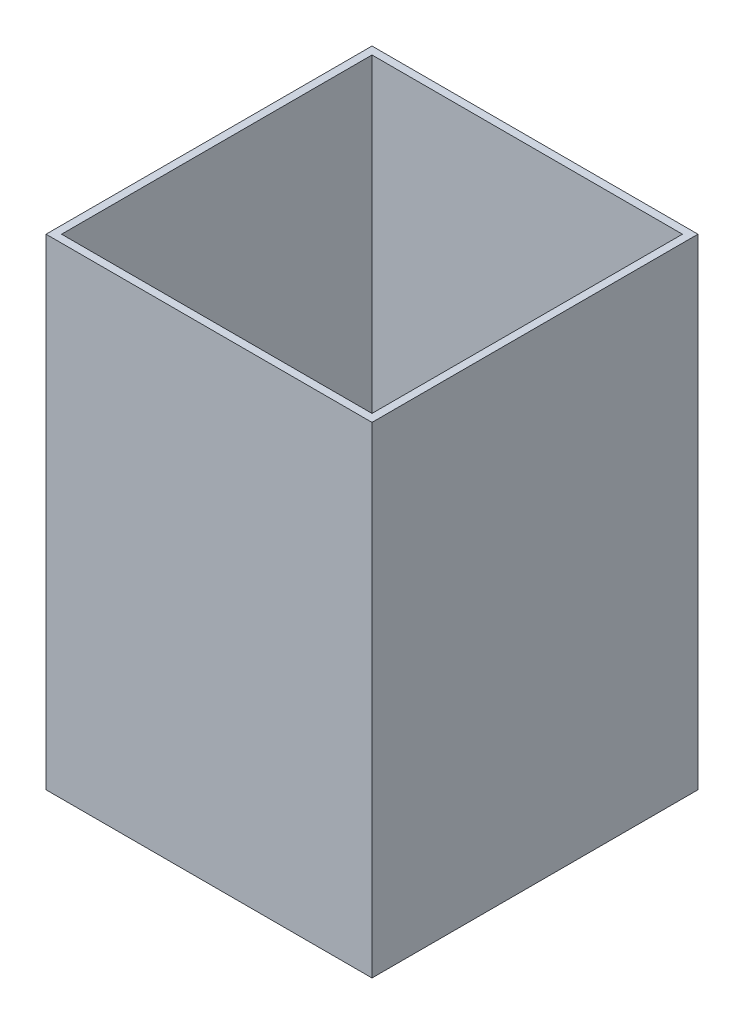
ISO-10303-21;
HEADER;
FILE_DESCRIPTION(('STEP AP214'),'2;1');
FILE_NAME('part.step','',(''),(''),'','','');
FILE_SCHEMA(('AUTOMOTIVE_DESIGN { 1 0 10303 214 1 1 1 1 }'));
ENDSEC;
DATA;
#1=APPLICATION_CONTEXT('core data for automotive mechanical design processes');
#2=APPLICATION_PROTOCOL_DEFINITION('international standard','automotive_design',2000,#1);
#3=PRODUCT_CONTEXT('',#1,'mechanical');
#4=PRODUCT('Part','Part','',(#3));
#5=PRODUCT_RELATED_PRODUCT_CATEGORY('part','',(#4));
#6=PRODUCT_DEFINITION_FORMATION('','',#4);
#7=PRODUCT_DEFINITION_CONTEXT('part definition',#1,'design');
#8=PRODUCT_DEFINITION('design','',#6,#7);
#9=PRODUCT_DEFINITION_SHAPE('','',#8);
#10=(LENGTH_UNIT() NAMED_UNIT(*) SI_UNIT(.MILLI.,.METRE.));
#11=(NAMED_UNIT(*) PLANE_ANGLE_UNIT() SI_UNIT($,.RADIAN.));
#12=(NAMED_UNIT(*) SI_UNIT($,.STERADIAN.) SOLID_ANGLE_UNIT());
#13=UNCERTAINTY_MEASURE_WITH_UNIT(LENGTH_MEASURE(1.E-05),#10,'distance_accuracy_value','');
#14=(GEOMETRIC_REPRESENTATION_CONTEXT(3) GLOBAL_UNCERTAINTY_ASSIGNED_CONTEXT((#13)) GLOBAL_UNIT_ASSIGNED_CONTEXT((#10,
#11,#12)) REPRESENTATION_CONTEXT('',''));
#15=CARTESIAN_POINT('',(0.,0.,0.));
#16=DIRECTION('',(0.,0.,1.));
#17=DIRECTION('',(1.,0.,0.));
#18=AXIS2_PLACEMENT_3D('',#15,#16,#17);
#19=CARTESIAN_POINT('',(0.,310.,0.));
#20=DIRECTION('',(0.,1.,0.));
#21=DIRECTION('',(0.,0.,1.));
#22=AXIS2_PLACEMENT_3D('',#19,#20,#21);
#23=PLANE('',#22);
#24=DIRECTION('',(0.,0.,-1.));
#25=VECTOR('',#24,1.);
#26=CARTESIAN_POINT('',(105.,310.,-105.));
#27=LINE('',#26,#25);
#28=CARTESIAN_POINT('',(105.,310.,105.));
#29=VERTEX_POINT('',#28);
#30=CARTESIAN_POINT('',(105.,310.,-105.));
#31=VERTEX_POINT('',#30);
#32=EDGE_CURVE('E148',#29,#31,#27,.T.);
#33=ORIENTED_EDGE('',*,*,#32,.T.);
#34=DIRECTION('',(-1.,0.,0.));
#35=VECTOR('',#34,1.);
#36=CARTESIAN_POINT('',(-105.,310.,-105.));
#37=LINE('',#36,#35);
#38=CARTESIAN_POINT('',(-105.,310.,-105.));
#39=VERTEX_POINT('',#38);
#40=EDGE_CURVE('E92',#31,#39,#37,.T.);
#41=ORIENTED_EDGE('',*,*,#40,.T.);
#42=DIRECTION('',(0.,0.,1.));
#43=VECTOR('',#42,1.);
#44=CARTESIAN_POINT('',(-105.,310.,-105.));
#45=LINE('',#44,#43);
#46=CARTESIAN_POINT('',(-105.,310.,105.));
#47=VERTEX_POINT('',#46);
#48=EDGE_CURVE('E151',#39,#47,#45,.T.);
#49=ORIENTED_EDGE('',*,*,#48,.T.);
#50=DIRECTION('',(1.,0.,0.));
#51=VECTOR('',#50,1.);
#52=CARTESIAN_POINT('',(-105.,310.,105.));
#53=LINE('',#52,#51);
#54=EDGE_CURVE('E64',#47,#29,#53,.T.);
#55=ORIENTED_EDGE('',*,*,#54,.T.);
#56=EDGE_LOOP('',(#33,#41,#49,#55));
#57=FACE_BOUND('',#56,.T.);
#58=DIRECTION('',(0.,0.,1.));
#59=VECTOR('',#58,1.);
#60=CARTESIAN_POINT('',(100.,310.,0.));
#61=LINE('',#60,#59);
#62=CARTESIAN_POINT('',(100.,310.,-100.));
#63=VERTEX_POINT('',#62);
#64=CARTESIAN_POINT('',(100.,310.,100.));
#65=VERTEX_POINT('',#64);
#66=EDGE_CURVE('E124',#63,#65,#61,.T.);
#67=ORIENTED_EDGE('',*,*,#66,.T.);
#68=DIRECTION('',(-1.,0.,0.));
#69=VECTOR('',#68,1.);
#70=CARTESIAN_POINT('',(0.,310.,100.));
#71=LINE('',#70,#69);
#72=CARTESIAN_POINT('',(-100.,310.,100.));
#73=VERTEX_POINT('',#72);
#74=EDGE_CURVE('E130',#65,#73,#71,.T.);
#75=ORIENTED_EDGE('',*,*,#74,.T.);
#76=DIRECTION('',(0.,0.,-1.));
#77=VECTOR('',#76,1.);
#78=CARTESIAN_POINT('',(-100.,310.,0.));
#79=LINE('',#78,#77);
#80=CARTESIAN_POINT('',(-100.,310.,-100.));
#81=VERTEX_POINT('',#80);
#82=EDGE_CURVE('E134',#73,#81,#79,.T.);
#83=ORIENTED_EDGE('',*,*,#82,.T.);
#84=DIRECTION('',(1.,0.,0.));
#85=VECTOR('',#84,1.);
#86=CARTESIAN_POINT('',(0.,310.,-100.));
#87=LINE('',#86,#85);
#88=EDGE_CURVE('E55',#81,#63,#87,.T.);
#89=ORIENTED_EDGE('',*,*,#88,.T.);
#90=EDGE_LOOP('',(#67,#75,#83,#89));
#91=FACE_BOUND('',#90,.T.);
#92=ADVANCED_FACE('F40',(#57,#91),#23,.T.);
#93=CARTESIAN_POINT('',(105.,310.,-105.));
#94=DIRECTION('',(-1.,0.,0.));
#95=DIRECTION('',(0.,0.,1.));
#96=AXIS2_PLACEMENT_3D('',#93,#94,#95);
#97=PLANE('',#96);
#98=DIRECTION('',(0.,0.,-1.));
#99=VECTOR('',#98,1.);
#100=CARTESIAN_POINT('',(105.,0.,-105.));
#101=LINE('',#100,#99);
#102=CARTESIAN_POINT('',(105.,0.,105.));
#103=VERTEX_POINT('',#102);
#104=CARTESIAN_POINT('',(105.,0.,-105.));
#105=VERTEX_POINT('',#104);
#106=EDGE_CURVE('E155',#103,#105,#101,.T.);
#107=ORIENTED_EDGE('',*,*,#106,.T.);
#108=DIRECTION('',(0.,-1.,0.));
#109=VECTOR('',#108,1.);
#110=CARTESIAN_POINT('',(105.,310.,-105.));
#111=LINE('',#110,#109);
#112=EDGE_CURVE('E12',#31,#105,#111,.T.);
#113=ORIENTED_EDGE('',*,*,#112,.F.);
#114=ORIENTED_EDGE('',*,*,#32,.F.);
#115=DIRECTION('',(0.,-1.,0.));
#116=VECTOR('',#115,1.);
#117=CARTESIAN_POINT('',(105.,310.,105.));
#118=LINE('',#117,#116);
#119=EDGE_CURVE('E154',#29,#103,#118,.T.);
#120=ORIENTED_EDGE('',*,*,#119,.T.);
#121=EDGE_LOOP('',(#107,#113,#114,#120));
#122=FACE_BOUND('',#121,.T.);
#123=ADVANCED_FACE('F42',(#122),#97,.F.);
#124=CARTESIAN_POINT('',(-105.,310.,-105.));
#125=DIRECTION('',(0.,0.,1.));
#126=DIRECTION('',(1.,0.,0.));
#127=AXIS2_PLACEMENT_3D('',#124,#125,#126);
#128=PLANE('',#127);
#129=DIRECTION('',(-1.,0.,0.));
#130=VECTOR('',#129,1.);
#131=CARTESIAN_POINT('',(-105.,0.,-105.));
#132=LINE('',#131,#130);
#133=CARTESIAN_POINT('',(-105.,0.,-105.));
#134=VERTEX_POINT('',#133);
#135=EDGE_CURVE('E158',#105,#134,#132,.T.);
#136=ORIENTED_EDGE('',*,*,#135,.T.);
#137=DIRECTION('',(0.,-1.,0.));
#138=VECTOR('',#137,1.);
#139=CARTESIAN_POINT('',(-105.,310.,-105.));
#140=LINE('',#139,#138);
#141=EDGE_CURVE('E48',#39,#134,#140,.T.);
#142=ORIENTED_EDGE('',*,*,#141,.F.);
#143=ORIENTED_EDGE('',*,*,#40,.F.);
#144=ORIENTED_EDGE('',*,*,#112,.T.);
#145=EDGE_LOOP('',(#136,#142,#143,#144));
#146=FACE_BOUND('',#145,.T.);
#147=ADVANCED_FACE('F187',(#146),#128,.F.);
#148=CARTESIAN_POINT('',(-105.,310.,-105.));
#149=DIRECTION('',(1.,0.,0.));
#150=DIRECTION('',(0.,0.,-1.));
#151=AXIS2_PLACEMENT_3D('',#148,#149,#150);
#152=PLANE('',#151);
#153=DIRECTION('',(0.,0.,1.));
#154=VECTOR('',#153,1.);
#155=CARTESIAN_POINT('',(-105.,0.,-105.));
#156=LINE('',#155,#154);
#157=CARTESIAN_POINT('',(-105.,0.,105.));
#158=VERTEX_POINT('',#157);
#159=EDGE_CURVE('E161',#134,#158,#156,.T.);
#160=ORIENTED_EDGE('',*,*,#159,.T.);
#161=DIRECTION('',(0.,-1.,0.));
#162=VECTOR('',#161,1.);
#163=CARTESIAN_POINT('',(-105.,310.,105.));
#164=LINE('',#163,#162);
#165=EDGE_CURVE('E165',#47,#158,#164,.T.);
#166=ORIENTED_EDGE('',*,*,#165,.F.);
#167=ORIENTED_EDGE('',*,*,#48,.F.);
#168=ORIENTED_EDGE('',*,*,#141,.T.);
#169=EDGE_LOOP('',(#160,#166,#167,#168));
#170=FACE_BOUND('',#169,.T.);
#171=ADVANCED_FACE('F170',(#170),#152,.F.);
#172=CARTESIAN_POINT('',(-105.,310.,105.));
#173=DIRECTION('',(0.,0.,-1.));
#174=DIRECTION('',(-1.,0.,0.));
#175=AXIS2_PLACEMENT_3D('',#172,#173,#174);
#176=PLANE('',#175);
#177=DIRECTION('',(1.,0.,0.));
#178=VECTOR('',#177,1.);
#179=CARTESIAN_POINT('',(-105.,0.,105.));
#180=LINE('',#179,#178);
#181=EDGE_CURVE('E85',#158,#103,#180,.T.);
#182=ORIENTED_EDGE('',*,*,#181,.T.);
#183=ORIENTED_EDGE('',*,*,#119,.F.);
#184=ORIENTED_EDGE('',*,*,#54,.F.);
#185=ORIENTED_EDGE('',*,*,#165,.T.);
#186=EDGE_LOOP('',(#182,#183,#184,#185));
#187=FACE_BOUND('',#186,.T.);
#188=ADVANCED_FACE('F178',(#187),#176,.F.);
#189=CARTESIAN_POINT('',(0.,0.,0.));
#190=DIRECTION('',(0.,1.,0.));
#191=DIRECTION('',(0.,0.,1.));
#192=AXIS2_PLACEMENT_3D('',#189,#190,#191);
#193=PLANE('',#192);
#194=ORIENTED_EDGE('',*,*,#106,.F.);
#195=ORIENTED_EDGE('',*,*,#181,.F.);
#196=ORIENTED_EDGE('',*,*,#159,.F.);
#197=ORIENTED_EDGE('',*,*,#135,.F.);
#198=EDGE_LOOP('',(#194,#195,#196,#197));
#199=FACE_BOUND('',#198,.T.);
#200=ADVANCED_FACE('F174',(#199),#193,.F.);
#201=CARTESIAN_POINT('',(0.,-282.842712474619,100.));
#202=DIRECTION('',(0.,0.,-1.));
#203=DIRECTION('',(-1.,0.,0.));
#204=AXIS2_PLACEMENT_3D('',#201,#202,#203);
#205=PLANE('',#204);
#206=DIRECTION('',(0.,1.,0.));
#207=VECTOR('',#206,1.);
#208=CARTESIAN_POINT('',(-100.,-282.842712474619,100.));
#209=LINE('',#208,#207);
#210=CARTESIAN_POINT('',(-100.,10.,100.));
#211=VERTEX_POINT('',#210);
#212=EDGE_CURVE('E140',#211,#73,#209,.T.);
#213=ORIENTED_EDGE('',*,*,#212,.T.);
#214=ORIENTED_EDGE('',*,*,#74,.F.);
#215=DIRECTION('',(0.,1.,0.));
#216=VECTOR('',#215,1.);
#217=CARTESIAN_POINT('',(100.,-282.842712474619,100.));
#218=LINE('',#217,#216);
#219=CARTESIAN_POINT('',(100.,10.,100.));
#220=VERTEX_POINT('',#219);
#221=EDGE_CURVE('E121',#220,#65,#218,.T.);
#222=ORIENTED_EDGE('',*,*,#221,.F.);
#223=DIRECTION('',(1.,0.,0.));
#224=VECTOR('',#223,1.);
#225=CARTESIAN_POINT('',(0.,10.,100.));
#226=LINE('',#225,#224);
#227=EDGE_CURVE('E144',#211,#220,#226,.T.);
#228=ORIENTED_EDGE('',*,*,#227,.F.);
#229=EDGE_LOOP('',(#213,#214,#222,#228));
#230=FACE_BOUND('',#229,.T.);
#231=ADVANCED_FACE('F185',(#230),#205,.T.);
#232=CARTESIAN_POINT('',(100.,-282.842712474619,0.));
#233=DIRECTION('',(-1.,0.,0.));
#234=DIRECTION('',(0.,0.,1.));
#235=AXIS2_PLACEMENT_3D('',#232,#233,#234);
#236=PLANE('',#235);
#237=ORIENTED_EDGE('',*,*,#221,.T.);
#238=ORIENTED_EDGE('',*,*,#66,.F.);
#239=DIRECTION('',(0.,1.,0.));
#240=VECTOR('',#239,1.);
#241=CARTESIAN_POINT('',(100.,-282.842712474619,-100.));
#242=LINE('',#241,#240);
#243=CARTESIAN_POINT('',(100.,10.,-100.));
#244=VERTEX_POINT('',#243);
#245=EDGE_CURVE('E113',#244,#63,#242,.T.);
#246=ORIENTED_EDGE('',*,*,#245,.F.);
#247=DIRECTION('',(0.,0.,-1.));
#248=VECTOR('',#247,1.);
#249=CARTESIAN_POINT('',(100.,10.,0.));
#250=LINE('',#249,#248);
#251=EDGE_CURVE('E147',#220,#244,#250,.T.);
#252=ORIENTED_EDGE('',*,*,#251,.F.);
#253=EDGE_LOOP('',(#237,#238,#246,#252));
#254=FACE_BOUND('',#253,.T.);
#255=ADVANCED_FACE('F125',(#254),#236,.T.);
#256=CARTESIAN_POINT('',(0.,-282.842712474619,-100.));
#257=DIRECTION('',(0.,0.,1.));
#258=DIRECTION('',(1.,0.,0.));
#259=AXIS2_PLACEMENT_3D('',#256,#257,#258);
#260=PLANE('',#259);
#261=ORIENTED_EDGE('',*,*,#245,.T.);
#262=ORIENTED_EDGE('',*,*,#88,.F.);
#263=DIRECTION('',(0.,1.,0.));
#264=VECTOR('',#263,1.);
#265=CARTESIAN_POINT('',(-100.,-282.842712474619,-100.));
#266=LINE('',#265,#264);
#267=CARTESIAN_POINT('',(-100.,10.,-100.));
#268=VERTEX_POINT('',#267);
#269=EDGE_CURVE('E120',#268,#81,#266,.T.);
#270=ORIENTED_EDGE('',*,*,#269,.F.);
#271=DIRECTION('',(-1.,0.,0.));
#272=VECTOR('',#271,1.);
#273=CARTESIAN_POINT('',(0.,10.,-100.));
#274=LINE('',#273,#272);
#275=EDGE_CURVE('E117',#244,#268,#274,.T.);
#276=ORIENTED_EDGE('',*,*,#275,.F.);
#277=EDGE_LOOP('',(#261,#262,#270,#276));
#278=FACE_BOUND('',#277,.T.);
#279=ADVANCED_FACE('F115',(#278),#260,.T.);
#280=CARTESIAN_POINT('',(-100.,-282.842712474619,0.));
#281=DIRECTION('',(1.,0.,0.));
#282=DIRECTION('',(0.,0.,-1.));
#283=AXIS2_PLACEMENT_3D('',#280,#281,#282);
#284=PLANE('',#283);
#285=ORIENTED_EDGE('',*,*,#269,.T.);
#286=ORIENTED_EDGE('',*,*,#82,.F.);
#287=ORIENTED_EDGE('',*,*,#212,.F.);
#288=DIRECTION('',(0.,0.,1.));
#289=VECTOR('',#288,1.);
#290=CARTESIAN_POINT('',(-100.,10.,0.));
#291=LINE('',#290,#289);
#292=EDGE_CURVE('E159',#268,#211,#291,.T.);
#293=ORIENTED_EDGE('',*,*,#292,.F.);
#294=EDGE_LOOP('',(#285,#286,#287,#293));
#295=FACE_BOUND('',#294,.T.);
#296=ADVANCED_FACE('F195',(#295),#284,.T.);
#297=CARTESIAN_POINT('',(0.,10.,0.));
#298=DIRECTION('',(0.,1.,0.));
#299=DIRECTION('',(0.,0.,1.));
#300=AXIS2_PLACEMENT_3D('',#297,#298,#299);
#301=PLANE('',#300);
#302=ORIENTED_EDGE('',*,*,#275,.T.);
#303=ORIENTED_EDGE('',*,*,#292,.T.);
#304=ORIENTED_EDGE('',*,*,#227,.T.);
#305=ORIENTED_EDGE('',*,*,#251,.T.);
#306=EDGE_LOOP('',(#302,#303,#304,#305));
#307=FACE_BOUND('',#306,.T.);
#308=ADVANCED_FACE('F198',(#307),#301,.T.);
#309=CLOSED_SHELL('',(#92,#123,#147,#171,#188,#200,#231,#255,#279,#296,#308));
#310=MANIFOLD_SOLID_BREP('B2',#309);
#311=ADVANCED_BREP_SHAPE_REPRESENTATION('',(#18,#310),#14);
#312=SHAPE_DEFINITION_REPRESENTATION(#9,#311);
ENDSEC;
END-ISO-10303-21;
